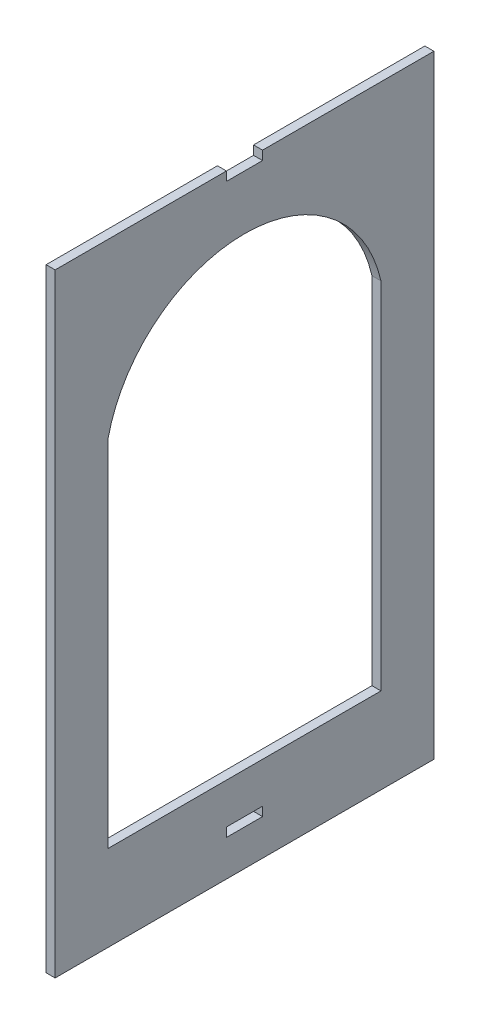
ISO-10303-21;
HEADER;
FILE_DESCRIPTION(('STEP AP214'),'2;1');
FILE_NAME('part.step','',(''),(''),'','','');
FILE_SCHEMA(('AUTOMOTIVE_DESIGN { 1 0 10303 214 1 1 1 1 }'));
ENDSEC;
DATA;
#1=APPLICATION_CONTEXT('core data for automotive mechanical design processes');
#2=APPLICATION_PROTOCOL_DEFINITION('international standard','automotive_design',2000,#1);
#3=PRODUCT_CONTEXT('',#1,'mechanical');
#4=PRODUCT('Part','Part','',(#3));
#5=PRODUCT_RELATED_PRODUCT_CATEGORY('part','',(#4));
#6=PRODUCT_DEFINITION_FORMATION('','',#4);
#7=PRODUCT_DEFINITION_CONTEXT('part definition',#1,'design');
#8=PRODUCT_DEFINITION('design','',#6,#7);
#9=PRODUCT_DEFINITION_SHAPE('','',#8);
#10=(LENGTH_UNIT() NAMED_UNIT(*) SI_UNIT(.MILLI.,.METRE.));
#11=(NAMED_UNIT(*) PLANE_ANGLE_UNIT() SI_UNIT($,.RADIAN.));
#12=(NAMED_UNIT(*) SI_UNIT($,.STERADIAN.) SOLID_ANGLE_UNIT());
#13=UNCERTAINTY_MEASURE_WITH_UNIT(LENGTH_MEASURE(1.E-05),#10,'distance_accuracy_value','');
#14=(GEOMETRIC_REPRESENTATION_CONTEXT(3) GLOBAL_UNCERTAINTY_ASSIGNED_CONTEXT((#13)) GLOBAL_UNIT_ASSIGNED_CONTEXT((#10,
#11,#12)) REPRESENTATION_CONTEXT('',''));
#15=CARTESIAN_POINT('',(0.,0.,0.));
#16=DIRECTION('',(0.,0.,1.));
#17=DIRECTION('',(1.,0.,0.));
#18=AXIS2_PLACEMENT_3D('',#15,#16,#17);
#19=CARTESIAN_POINT('',(6.35,0.,0.));
#20=DIRECTION('',(1.,0.,0.));
#21=DIRECTION('',(0.,0.,-1.));
#22=AXIS2_PLACEMENT_3D('',#19,#20,#21);
#23=PLANE('',#22);
#24=DIRECTION('',(0.,1.,0.));
#25=VECTOR('',#24,1.);
#26=CARTESIAN_POINT('',(6.35,215.9,-133.35));
#27=LINE('',#26,#25);
#28=CARTESIAN_POINT('',(6.35,-215.9,-133.35));
#29=VERTEX_POINT('',#28);
#30=CARTESIAN_POINT('',(6.35,215.9,-133.35));
#31=VERTEX_POINT('',#30);
#32=EDGE_CURVE('E215',#29,#31,#27,.T.);
#33=ORIENTED_EDGE('',*,*,#32,.T.);
#34=DIRECTION('',(0.,0.,1.));
#35=VECTOR('',#34,1.);
#36=CARTESIAN_POINT('',(6.35,215.9,-12.7));
#37=LINE('',#36,#35);
#38=CARTESIAN_POINT('',(6.35,215.9,-12.7));
#39=VERTEX_POINT('',#38);
#40=EDGE_CURVE('E218',#31,#39,#37,.T.);
#41=ORIENTED_EDGE('',*,*,#40,.T.);
#42=DIRECTION('',(0.,-1.,0.));
#43=VECTOR('',#42,1.);
#44=CARTESIAN_POINT('',(6.35,209.55,-12.7));
#45=LINE('',#44,#43);
#46=CARTESIAN_POINT('',(6.35,209.55,-12.7));
#47=VERTEX_POINT('',#46);
#48=EDGE_CURVE('E221',#39,#47,#45,.T.);
#49=ORIENTED_EDGE('',*,*,#48,.T.);
#50=DIRECTION('',(0.,0.,1.));
#51=VECTOR('',#50,1.);
#52=CARTESIAN_POINT('',(6.35,209.55,12.6999999999998));
#53=LINE('',#52,#51);
#54=CARTESIAN_POINT('',(6.35,209.55,12.6999999999998));
#55=VERTEX_POINT('',#54);
#56=EDGE_CURVE('E223',#47,#55,#53,.T.);
#57=ORIENTED_EDGE('',*,*,#56,.T.);
#58=DIRECTION('',(0.,1.,0.));
#59=VECTOR('',#58,1.);
#60=CARTESIAN_POINT('',(6.35,209.55,12.6999999999998));
#61=LINE('',#60,#59);
#62=CARTESIAN_POINT('',(6.35,215.9,12.6999999999998));
#63=VERTEX_POINT('',#62);
#64=EDGE_CURVE('E225',#55,#63,#61,.T.);
#65=ORIENTED_EDGE('',*,*,#64,.T.);
#66=DIRECTION('',(0.,0.,1.));
#67=VECTOR('',#66,1.);
#68=CARTESIAN_POINT('',(6.35,215.9,133.35));
#69=LINE('',#68,#67);
#70=CARTESIAN_POINT('',(6.35,215.9,133.35));
#71=VERTEX_POINT('',#70);
#72=EDGE_CURVE('E227',#63,#71,#69,.T.);
#73=ORIENTED_EDGE('',*,*,#72,.T.);
#74=DIRECTION('',(0.,-1.,0.));
#75=VECTOR('',#74,1.);
#76=CARTESIAN_POINT('',(6.35,215.9,133.35));
#77=LINE('',#76,#75);
#78=CARTESIAN_POINT('',(6.35,-215.9,133.35));
#79=VERTEX_POINT('',#78);
#80=EDGE_CURVE('E229',#71,#79,#77,.T.);
#81=ORIENTED_EDGE('',*,*,#80,.T.);
#82=DIRECTION('',(0.,0.,-1.));
#83=VECTOR('',#82,1.);
#84=CARTESIAN_POINT('',(6.35,-215.9,133.35));
#85=LINE('',#84,#83);
#86=EDGE_CURVE('E231',#79,#29,#85,.T.);
#87=ORIENTED_EDGE('',*,*,#86,.T.);
#88=EDGE_LOOP('',(#33,#41,#49,#57,#65,#73,#81,#87));
#89=FACE_BOUND('',#88,.T.);
#90=DIRECTION('',(0.,0.,1.));
#91=VECTOR('',#90,1.);
#92=CARTESIAN_POINT('',(6.35,-184.15,12.7));
#93=LINE('',#92,#91);
#94=CARTESIAN_POINT('',(6.35,-184.15,-12.7));
#95=VERTEX_POINT('',#94);
#96=CARTESIAN_POINT('',(6.35,-184.15,12.7));
#97=VERTEX_POINT('',#96);
#98=EDGE_CURVE('E186',#95,#97,#93,.T.);
#99=ORIENTED_EDGE('',*,*,#98,.F.);
#100=DIRECTION('',(0.,1.,0.));
#101=VECTOR('',#100,1.);
#102=CARTESIAN_POINT('',(6.35,-184.15,-12.7));
#103=LINE('',#102,#101);
#104=CARTESIAN_POINT('',(6.35,-190.5,-12.7));
#105=VERTEX_POINT('',#104);
#106=EDGE_CURVE('E184',#105,#95,#103,.T.);
#107=ORIENTED_EDGE('',*,*,#106,.F.);
#108=DIRECTION('',(0.,0.,-1.));
#109=VECTOR('',#108,1.);
#110=CARTESIAN_POINT('',(6.35,-190.5,12.7));
#111=LINE('',#110,#109);
#112=CARTESIAN_POINT('',(6.35,-190.5,12.7));
#113=VERTEX_POINT('',#112);
#114=EDGE_CURVE('E192',#113,#105,#111,.T.);
#115=ORIENTED_EDGE('',*,*,#114,.F.);
#116=DIRECTION('',(0.,-1.,0.));
#117=VECTOR('',#116,1.);
#118=CARTESIAN_POINT('',(6.35,-184.15,12.7));
#119=LINE('',#118,#117);
#120=EDGE_CURVE('E189',#97,#113,#119,.T.);
#121=ORIENTED_EDGE('',*,*,#120,.F.);
#122=EDGE_LOOP('',(#99,#107,#115,#121));
#123=FACE_BOUND('',#122,.T.);
#124=CARTESIAN_POINT('',(6.35,72.8095333447275,0.));
#125=DIRECTION('',(1.,0.,0.));
#126=DIRECTION('',(0.,0.,1.));
#127=AXIS2_PLACEMENT_3D('',#124,#125,#126);
#128=CIRCLE('',#127,98.4789578135907);
#129=CARTESIAN_POINT('',(6.35,94.4580952380953,-96.07));
#130=VERTEX_POINT('',#129);
#131=CARTESIAN_POINT('',(6.35,94.4580952380953,96.07));
#132=VERTEX_POINT('',#131);
#133=EDGE_CURVE('E156',#130,#132,#128,.T.);
#134=ORIENTED_EDGE('',*,*,#133,.F.);
#135=DIRECTION('',(0.,1.,0.));
#136=VECTOR('',#135,1.);
#137=CARTESIAN_POINT('',(6.35,94.4580952380952,-96.07));
#138=LINE('',#137,#136);
#139=CARTESIAN_POINT('',(6.35,-155.541904761905,-96.07));
#140=VERTEX_POINT('',#139);
#141=EDGE_CURVE('E148',#140,#130,#138,.T.);
#142=ORIENTED_EDGE('',*,*,#141,.F.);
#143=DIRECTION('',(0.,0.,-1.));
#144=VECTOR('',#143,1.);
#145=CARTESIAN_POINT('',(6.35,-155.541904761905,96.07));
#146=LINE('',#145,#144);
#147=CARTESIAN_POINT('',(6.35,-155.541904761905,96.07));
#148=VERTEX_POINT('',#147);
#149=EDGE_CURVE('E170',#148,#140,#146,.T.);
#150=ORIENTED_EDGE('',*,*,#149,.F.);
#151=DIRECTION('',(0.,-1.,0.));
#152=VECTOR('',#151,1.);
#153=CARTESIAN_POINT('',(6.35,94.4580952380953,96.07));
#154=LINE('',#153,#152);
#155=EDGE_CURVE('E168',#132,#148,#154,.T.);
#156=ORIENTED_EDGE('',*,*,#155,.F.);
#157=EDGE_LOOP('',(#134,#142,#150,#156));
#158=FACE_BOUND('',#157,.T.);
#159=ADVANCED_FACE('F35',(#89,#123,#158),#23,.T.);
#160=CARTESIAN_POINT('',(0.,0.,0.));
#161=DIRECTION('',(1.,0.,0.));
#162=DIRECTION('',(0.,0.,-1.));
#163=AXIS2_PLACEMENT_3D('',#160,#161,#162);
#164=PLANE('',#163);
#165=DIRECTION('',(0.,1.,0.));
#166=VECTOR('',#165,1.);
#167=CARTESIAN_POINT('',(0.,-184.15,-12.7));
#168=LINE('',#167,#166);
#169=CARTESIAN_POINT('',(0.,-190.5,-12.7));
#170=VERTEX_POINT('',#169);
#171=CARTESIAN_POINT('',(0.,-184.15,-12.7));
#172=VERTEX_POINT('',#171);
#173=EDGE_CURVE('E164',#170,#172,#168,.T.);
#174=ORIENTED_EDGE('',*,*,#173,.T.);
#175=DIRECTION('',(0.,0.,1.));
#176=VECTOR('',#175,1.);
#177=CARTESIAN_POINT('',(0.,-184.15,12.7));
#178=LINE('',#177,#176);
#179=CARTESIAN_POINT('',(0.,-184.15,12.7));
#180=VERTEX_POINT('',#179);
#181=EDGE_CURVE('E197',#172,#180,#178,.T.);
#182=ORIENTED_EDGE('',*,*,#181,.T.);
#183=DIRECTION('',(0.,-1.,0.));
#184=VECTOR('',#183,1.);
#185=CARTESIAN_POINT('',(0.,-184.15,12.7));
#186=LINE('',#185,#184);
#187=CARTESIAN_POINT('',(0.,-190.5,12.7));
#188=VERTEX_POINT('',#187);
#189=EDGE_CURVE('E200',#180,#188,#186,.T.);
#190=ORIENTED_EDGE('',*,*,#189,.T.);
#191=DIRECTION('',(0.,0.,-1.));
#192=VECTOR('',#191,1.);
#193=CARTESIAN_POINT('',(0.,-190.5,12.7));
#194=LINE('',#193,#192);
#195=EDGE_CURVE('E187',#188,#170,#194,.T.);
#196=ORIENTED_EDGE('',*,*,#195,.T.);
#197=EDGE_LOOP('',(#174,#182,#190,#196));
#198=FACE_BOUND('',#197,.T.);
#199=DIRECTION('',(0.,1.,0.));
#200=VECTOR('',#199,1.);
#201=CARTESIAN_POINT('',(0.,215.9,-133.35));
#202=LINE('',#201,#200);
#203=CARTESIAN_POINT('',(0.,-215.9,-133.35));
#204=VERTEX_POINT('',#203);
#205=CARTESIAN_POINT('',(0.,215.9,-133.35));
#206=VERTEX_POINT('',#205);
#207=EDGE_CURVE('E214',#204,#206,#202,.T.);
#208=ORIENTED_EDGE('',*,*,#207,.F.);
#209=DIRECTION('',(0.,0.,-1.));
#210=VECTOR('',#209,1.);
#211=CARTESIAN_POINT('',(0.,-215.9,133.35));
#212=LINE('',#211,#210);
#213=CARTESIAN_POINT('',(0.,-215.9,133.35));
#214=VERTEX_POINT('',#213);
#215=EDGE_CURVE('E219',#214,#204,#212,.T.);
#216=ORIENTED_EDGE('',*,*,#215,.F.);
#217=DIRECTION('',(0.,-1.,0.));
#218=VECTOR('',#217,1.);
#219=CARTESIAN_POINT('',(0.,215.9,133.35));
#220=LINE('',#219,#218);
#221=CARTESIAN_POINT('',(0.,215.9,133.35));
#222=VERTEX_POINT('',#221);
#223=EDGE_CURVE('E246',#222,#214,#220,.T.);
#224=ORIENTED_EDGE('',*,*,#223,.F.);
#225=DIRECTION('',(0.,0.,1.));
#226=VECTOR('',#225,1.);
#227=CARTESIAN_POINT('',(0.,215.9,133.35));
#228=LINE('',#227,#226);
#229=CARTESIAN_POINT('',(0.,215.9,12.6999999999998));
#230=VERTEX_POINT('',#229);
#231=EDGE_CURVE('E244',#230,#222,#228,.T.);
#232=ORIENTED_EDGE('',*,*,#231,.F.);
#233=DIRECTION('',(0.,1.,0.));
#234=VECTOR('',#233,1.);
#235=CARTESIAN_POINT('',(0.,209.55,12.6999999999998));
#236=LINE('',#235,#234);
#237=CARTESIAN_POINT('',(0.,209.55,12.6999999999998));
#238=VERTEX_POINT('',#237);
#239=EDGE_CURVE('E242',#238,#230,#236,.T.);
#240=ORIENTED_EDGE('',*,*,#239,.F.);
#241=DIRECTION('',(0.,0.,1.));
#242=VECTOR('',#241,1.);
#243=CARTESIAN_POINT('',(0.,209.55,12.6999999999998));
#244=LINE('',#243,#242);
#245=CARTESIAN_POINT('',(0.,209.55,-12.7));
#246=VERTEX_POINT('',#245);
#247=EDGE_CURVE('E240',#246,#238,#244,.T.);
#248=ORIENTED_EDGE('',*,*,#247,.F.);
#249=DIRECTION('',(0.,-1.,0.));
#250=VECTOR('',#249,1.);
#251=CARTESIAN_POINT('',(0.,209.55,-12.7));
#252=LINE('',#251,#250);
#253=CARTESIAN_POINT('',(0.,215.9,-12.7));
#254=VERTEX_POINT('',#253);
#255=EDGE_CURVE('E238',#254,#246,#252,.T.);
#256=ORIENTED_EDGE('',*,*,#255,.F.);
#257=DIRECTION('',(0.,0.,1.));
#258=VECTOR('',#257,1.);
#259=CARTESIAN_POINT('',(0.,215.9,-12.7));
#260=LINE('',#259,#258);
#261=EDGE_CURVE('E236',#206,#254,#260,.T.);
#262=ORIENTED_EDGE('',*,*,#261,.F.);
#263=EDGE_LOOP('',(#208,#216,#224,#232,#240,#248,#256,#262));
#264=FACE_BOUND('',#263,.T.);
#265=DIRECTION('',(0.,1.,0.));
#266=VECTOR('',#265,1.);
#267=CARTESIAN_POINT('',(0.,94.4580952380952,-96.07));
#268=LINE('',#267,#266);
#269=CARTESIAN_POINT('',(0.,-155.541904761905,-96.07));
#270=VERTEX_POINT('',#269);
#271=CARTESIAN_POINT('',(0.,94.4580952380953,-96.07));
#272=VERTEX_POINT('',#271);
#273=EDGE_CURVE('E58',#270,#272,#268,.T.);
#274=ORIENTED_EDGE('',*,*,#273,.T.);
#275=CARTESIAN_POINT('',(0.,72.8095333447275,0.));
#276=DIRECTION('',(1.,0.,0.));
#277=DIRECTION('',(0.,0.,1.));
#278=AXIS2_PLACEMENT_3D('',#275,#276,#277);
#279=CIRCLE('',#278,98.4789578135907);
#280=CARTESIAN_POINT('',(0.,94.4580952380953,96.07));
#281=VERTEX_POINT('',#280);
#282=EDGE_CURVE('E163',#272,#281,#279,.T.);
#283=ORIENTED_EDGE('',*,*,#282,.T.);
#284=DIRECTION('',(0.,-1.,0.));
#285=VECTOR('',#284,1.);
#286=CARTESIAN_POINT('',(0.,94.4580952380953,96.07));
#287=LINE('',#286,#285);
#288=CARTESIAN_POINT('',(0.,-155.541904761905,96.07));
#289=VERTEX_POINT('',#288);
#290=EDGE_CURVE('E176',#281,#289,#287,.T.);
#291=ORIENTED_EDGE('',*,*,#290,.T.);
#292=DIRECTION('',(0.,0.,-1.));
#293=VECTOR('',#292,1.);
#294=CARTESIAN_POINT('',(0.,-155.541904761905,96.07));
#295=LINE('',#294,#293);
#296=EDGE_CURVE('E157',#289,#270,#295,.T.);
#297=ORIENTED_EDGE('',*,*,#296,.T.);
#298=EDGE_LOOP('',(#274,#283,#291,#297));
#299=FACE_BOUND('',#298,.T.);
#300=ADVANCED_FACE('F276',(#198,#264,#299),#164,.F.);
#301=CARTESIAN_POINT('',(6.35,215.9,-133.35));
#302=DIRECTION('',(0.,0.,1.));
#303=DIRECTION('',(0.,-1.,0.));
#304=AXIS2_PLACEMENT_3D('',#301,#302,#303);
#305=PLANE('',#304);
#306=ORIENTED_EDGE('',*,*,#207,.T.);
#307=DIRECTION('',(-1.,0.,0.));
#308=VECTOR('',#307,1.);
#309=CARTESIAN_POINT('',(6.35,215.9,-133.35));
#310=LINE('',#309,#308);
#311=EDGE_CURVE('E11',#31,#206,#310,.T.);
#312=ORIENTED_EDGE('',*,*,#311,.F.);
#313=ORIENTED_EDGE('',*,*,#32,.F.);
#314=DIRECTION('',(-1.,0.,0.));
#315=VECTOR('',#314,1.);
#316=CARTESIAN_POINT('',(6.35,-215.9,-133.35));
#317=LINE('',#316,#315);
#318=EDGE_CURVE('E233',#29,#204,#317,.T.);
#319=ORIENTED_EDGE('',*,*,#318,.T.);
#320=EDGE_LOOP('',(#306,#312,#313,#319));
#321=FACE_BOUND('',#320,.T.);
#322=ADVANCED_FACE('F37',(#321),#305,.F.);
#323=CARTESIAN_POINT('',(6.35,215.9,-12.7));
#324=DIRECTION('',(0.,-1.,0.));
#325=DIRECTION('',(0.,0.,-1.));
#326=AXIS2_PLACEMENT_3D('',#323,#324,#325);
#327=PLANE('',#326);
#328=ORIENTED_EDGE('',*,*,#261,.T.);
#329=DIRECTION('',(-1.,0.,0.));
#330=VECTOR('',#329,1.);
#331=CARTESIAN_POINT('',(6.35,215.9,-12.7));
#332=LINE('',#331,#330);
#333=EDGE_CURVE('E43',#39,#254,#332,.T.);
#334=ORIENTED_EDGE('',*,*,#333,.F.);
#335=ORIENTED_EDGE('',*,*,#40,.F.);
#336=ORIENTED_EDGE('',*,*,#311,.T.);
#337=EDGE_LOOP('',(#328,#334,#335,#336));
#338=FACE_BOUND('',#337,.T.);
#339=ADVANCED_FACE('F294',(#338),#327,.F.);
#340=CARTESIAN_POINT('',(6.35,209.55,-12.7));
#341=DIRECTION('',(0.,0.,-1.));
#342=DIRECTION('',(-1.,0.,0.));
#343=AXIS2_PLACEMENT_3D('',#340,#341,#342);
#344=PLANE('',#343);
#345=ORIENTED_EDGE('',*,*,#255,.T.);
#346=DIRECTION('',(-1.,0.,0.));
#347=VECTOR('',#346,1.);
#348=CARTESIAN_POINT('',(6.35,209.55,-12.7));
#349=LINE('',#348,#347);
#350=EDGE_CURVE('E263',#47,#246,#349,.T.);
#351=ORIENTED_EDGE('',*,*,#350,.F.);
#352=ORIENTED_EDGE('',*,*,#48,.F.);
#353=ORIENTED_EDGE('',*,*,#333,.T.);
#354=EDGE_LOOP('',(#345,#351,#352,#353));
#355=FACE_BOUND('',#354,.T.);
#356=ADVANCED_FACE('F270',(#355),#344,.F.);
#357=CARTESIAN_POINT('',(6.35,209.55,12.6999999999998));
#358=DIRECTION('',(0.,-1.,0.));
#359=DIRECTION('',(0.,0.,-1.));
#360=AXIS2_PLACEMENT_3D('',#357,#358,#359);
#361=PLANE('',#360);
#362=ORIENTED_EDGE('',*,*,#247,.T.);
#363=DIRECTION('',(-1.,0.,0.));
#364=VECTOR('',#363,1.);
#365=CARTESIAN_POINT('',(6.35,209.55,12.6999999999998));
#366=LINE('',#365,#364);
#367=EDGE_CURVE('E260',#55,#238,#366,.T.);
#368=ORIENTED_EDGE('',*,*,#367,.F.);
#369=ORIENTED_EDGE('',*,*,#56,.F.);
#370=ORIENTED_EDGE('',*,*,#350,.T.);
#371=EDGE_LOOP('',(#362,#368,#369,#370));
#372=FACE_BOUND('',#371,.T.);
#373=ADVANCED_FACE('F282',(#372),#361,.F.);
#374=CARTESIAN_POINT('',(6.35,209.55,12.6999999999998));
#375=DIRECTION('',(0.,0.,1.));
#376=DIRECTION('',(1.,0.,0.));
#377=AXIS2_PLACEMENT_3D('',#374,#375,#376);
#378=PLANE('',#377);
#379=ORIENTED_EDGE('',*,*,#239,.T.);
#380=DIRECTION('',(-1.,0.,0.));
#381=VECTOR('',#380,1.);
#382=CARTESIAN_POINT('',(6.35,215.9,12.6999999999998));
#383=LINE('',#382,#381);
#384=EDGE_CURVE('E257',#63,#230,#383,.T.);
#385=ORIENTED_EDGE('',*,*,#384,.F.);
#386=ORIENTED_EDGE('',*,*,#64,.F.);
#387=ORIENTED_EDGE('',*,*,#367,.T.);
#388=EDGE_LOOP('',(#379,#385,#386,#387));
#389=FACE_BOUND('',#388,.T.);
#390=ADVANCED_FACE('F286',(#389),#378,.F.);
#391=CARTESIAN_POINT('',(6.35,215.9,133.35));
#392=DIRECTION('',(0.,-1.,0.));
#393=DIRECTION('',(0.,0.,-1.));
#394=AXIS2_PLACEMENT_3D('',#391,#392,#393);
#395=PLANE('',#394);
#396=ORIENTED_EDGE('',*,*,#231,.T.);
#397=DIRECTION('',(-1.,0.,0.));
#398=VECTOR('',#397,1.);
#399=CARTESIAN_POINT('',(6.35,215.9,133.35));
#400=LINE('',#399,#398);
#401=EDGE_CURVE('E254',#71,#222,#400,.T.);
#402=ORIENTED_EDGE('',*,*,#401,.F.);
#403=ORIENTED_EDGE('',*,*,#72,.F.);
#404=ORIENTED_EDGE('',*,*,#384,.T.);
#405=EDGE_LOOP('',(#396,#402,#403,#404));
#406=FACE_BOUND('',#405,.T.);
#407=ADVANCED_FACE('F307',(#406),#395,.F.);
#408=CARTESIAN_POINT('',(6.35,215.9,133.35));
#409=DIRECTION('',(0.,0.,-1.));
#410=DIRECTION('',(0.,1.,0.));
#411=AXIS2_PLACEMENT_3D('',#408,#409,#410);
#412=PLANE('',#411);
#413=ORIENTED_EDGE('',*,*,#223,.T.);
#414=DIRECTION('',(-1.,0.,0.));
#415=VECTOR('',#414,1.);
#416=CARTESIAN_POINT('',(6.35,-215.9,133.35));
#417=LINE('',#416,#415);
#418=EDGE_CURVE('E251',#79,#214,#417,.T.);
#419=ORIENTED_EDGE('',*,*,#418,.F.);
#420=ORIENTED_EDGE('',*,*,#80,.F.);
#421=ORIENTED_EDGE('',*,*,#401,.T.);
#422=EDGE_LOOP('',(#413,#419,#420,#421));
#423=FACE_BOUND('',#422,.T.);
#424=ADVANCED_FACE('F305',(#423),#412,.F.);
#425=CARTESIAN_POINT('',(6.35,-215.9,133.35));
#426=DIRECTION('',(0.,1.,0.));
#427=DIRECTION('',(0.,0.,1.));
#428=AXIS2_PLACEMENT_3D('',#425,#426,#427);
#429=PLANE('',#428);
#430=ORIENTED_EDGE('',*,*,#215,.T.);
#431=ORIENTED_EDGE('',*,*,#318,.F.);
#432=ORIENTED_EDGE('',*,*,#86,.F.);
#433=ORIENTED_EDGE('',*,*,#418,.T.);
#434=EDGE_LOOP('',(#430,#431,#432,#433));
#435=FACE_BOUND('',#434,.T.);
#436=ADVANCED_FACE('F300',(#435),#429,.F.);
#437=CARTESIAN_POINT('',(6.35,-184.15,-12.7));
#438=DIRECTION('',(0.,0.,1.));
#439=DIRECTION('',(0.,-1.,0.));
#440=AXIS2_PLACEMENT_3D('',#437,#438,#439);
#441=PLANE('',#440);
#442=ORIENTED_EDGE('',*,*,#173,.F.);
#443=DIRECTION('',(-1.,0.,0.));
#444=VECTOR('',#443,1.);
#445=CARTESIAN_POINT('',(6.35,-190.5,-12.7));
#446=LINE('',#445,#444);
#447=EDGE_CURVE('E194',#105,#170,#446,.T.);
#448=ORIENTED_EDGE('',*,*,#447,.F.);
#449=ORIENTED_EDGE('',*,*,#106,.T.);
#450=DIRECTION('',(-1.,0.,0.));
#451=VECTOR('',#450,1.);
#452=CARTESIAN_POINT('',(6.35,-184.15,-12.7));
#453=LINE('',#452,#451);
#454=EDGE_CURVE('E211',#95,#172,#453,.T.);
#455=ORIENTED_EDGE('',*,*,#454,.T.);
#456=EDGE_LOOP('',(#442,#448,#449,#455));
#457=FACE_BOUND('',#456,.T.);
#458=ADVANCED_FACE('F324',(#457),#441,.T.);
#459=CARTESIAN_POINT('',(6.35,-184.15,12.7));
#460=DIRECTION('',(0.,-1.,0.));
#461=DIRECTION('',(0.,0.,-1.));
#462=AXIS2_PLACEMENT_3D('',#459,#460,#461);
#463=PLANE('',#462);
#464=ORIENTED_EDGE('',*,*,#181,.F.);
#465=ORIENTED_EDGE('',*,*,#454,.F.);
#466=ORIENTED_EDGE('',*,*,#98,.T.);
#467=DIRECTION('',(-1.,0.,0.));
#468=VECTOR('',#467,1.);
#469=CARTESIAN_POINT('',(6.35,-184.15,12.7));
#470=LINE('',#469,#468);
#471=EDGE_CURVE('E209',#97,#180,#470,.T.);
#472=ORIENTED_EDGE('',*,*,#471,.T.);
#473=EDGE_LOOP('',(#464,#465,#466,#472));
#474=FACE_BOUND('',#473,.T.);
#475=ADVANCED_FACE('F331',(#474),#463,.T.);
#476=CARTESIAN_POINT('',(6.35,-184.15,12.7));
#477=DIRECTION('',(0.,0.,-1.));
#478=DIRECTION('',(-1.,0.,0.));
#479=AXIS2_PLACEMENT_3D('',#476,#477,#478);
#480=PLANE('',#479);
#481=ORIENTED_EDGE('',*,*,#189,.F.);
#482=ORIENTED_EDGE('',*,*,#471,.F.);
#483=ORIENTED_EDGE('',*,*,#120,.T.);
#484=DIRECTION('',(-1.,0.,0.));
#485=VECTOR('',#484,1.);
#486=CARTESIAN_POINT('',(6.35,-190.5,12.7));
#487=LINE('',#486,#485);
#488=EDGE_CURVE('E207',#113,#188,#487,.T.);
#489=ORIENTED_EDGE('',*,*,#488,.T.);
#490=EDGE_LOOP('',(#481,#482,#483,#489));
#491=FACE_BOUND('',#490,.T.);
#492=ADVANCED_FACE('F336',(#491),#480,.T.);
#493=CARTESIAN_POINT('',(6.35,-190.5,12.7));
#494=DIRECTION('',(0.,1.,0.));
#495=DIRECTION('',(0.,0.,1.));
#496=AXIS2_PLACEMENT_3D('',#493,#494,#495);
#497=PLANE('',#496);
#498=ORIENTED_EDGE('',*,*,#195,.F.);
#499=ORIENTED_EDGE('',*,*,#488,.F.);
#500=ORIENTED_EDGE('',*,*,#114,.T.);
#501=ORIENTED_EDGE('',*,*,#447,.T.);
#502=EDGE_LOOP('',(#498,#499,#500,#501));
#503=FACE_BOUND('',#502,.T.);
#504=ADVANCED_FACE('F343',(#503),#497,.T.);
#505=CARTESIAN_POINT('',(6.35,94.4580952380952,-96.07));
#506=DIRECTION('',(0.,0.,1.));
#507=DIRECTION('',(0.,-1.,0.));
#508=AXIS2_PLACEMENT_3D('',#505,#506,#507);
#509=PLANE('',#508);
#510=ORIENTED_EDGE('',*,*,#273,.F.);
#511=DIRECTION('',(-1.,0.,0.));
#512=VECTOR('',#511,1.);
#513=CARTESIAN_POINT('',(6.35,-155.541904761905,-96.07));
#514=LINE('',#513,#512);
#515=EDGE_CURVE('E152',#140,#270,#514,.T.);
#516=ORIENTED_EDGE('',*,*,#515,.F.);
#517=ORIENTED_EDGE('',*,*,#141,.T.);
#518=DIRECTION('',(-1.,0.,0.));
#519=VECTOR('',#518,1.);
#520=CARTESIAN_POINT('',(6.35,94.4580952380953,-96.07));
#521=LINE('',#520,#519);
#522=EDGE_CURVE('E151',#130,#272,#521,.T.);
#523=ORIENTED_EDGE('',*,*,#522,.T.);
#524=EDGE_LOOP('',(#510,#516,#517,#523));
#525=FACE_BOUND('',#524,.T.);
#526=ADVANCED_FACE('F150',(#525),#509,.T.);
#527=CARTESIAN_POINT('',(6.35,72.8095333447275,0.));
#528=DIRECTION('',(-1.,0.,0.));
#529=DIRECTION('',(0.,0.,1.));
#530=AXIS2_PLACEMENT_3D('',#527,#528,#529);
#531=CYLINDRICAL_SURFACE('',#530,98.4789578135907);
#532=ORIENTED_EDGE('',*,*,#282,.F.);
#533=ORIENTED_EDGE('',*,*,#522,.F.);
#534=ORIENTED_EDGE('',*,*,#133,.T.);
#535=DIRECTION('',(-1.,0.,0.));
#536=VECTOR('',#535,1.);
#537=CARTESIAN_POINT('',(6.35,94.4580952380953,96.07));
#538=LINE('',#537,#536);
#539=EDGE_CURVE('E165',#132,#281,#538,.T.);
#540=ORIENTED_EDGE('',*,*,#539,.T.);
#541=EDGE_LOOP('',(#532,#533,#534,#540));
#542=FACE_BOUND('',#541,.T.);
#543=ADVANCED_FACE('F160',(#542),#531,.F.);
#544=CARTESIAN_POINT('',(6.35,94.4580952380953,96.07));
#545=DIRECTION('',(0.,0.,-1.));
#546=DIRECTION('',(0.,1.,0.));
#547=AXIS2_PLACEMENT_3D('',#544,#545,#546);
#548=PLANE('',#547);
#549=ORIENTED_EDGE('',*,*,#290,.F.);
#550=ORIENTED_EDGE('',*,*,#539,.F.);
#551=ORIENTED_EDGE('',*,*,#155,.T.);
#552=DIRECTION('',(-1.,0.,0.));
#553=VECTOR('',#552,1.);
#554=CARTESIAN_POINT('',(6.35,-155.541904761905,96.07));
#555=LINE('',#554,#553);
#556=EDGE_CURVE('E50',#148,#289,#555,.T.);
#557=ORIENTED_EDGE('',*,*,#556,.T.);
#558=EDGE_LOOP('',(#549,#550,#551,#557));
#559=FACE_BOUND('',#558,.T.);
#560=ADVANCED_FACE('F361',(#559),#548,.T.);
#561=CARTESIAN_POINT('',(6.35,-155.541904761905,96.07));
#562=DIRECTION('',(0.,1.,0.));
#563=DIRECTION('',(0.,0.,1.));
#564=AXIS2_PLACEMENT_3D('',#561,#562,#563);
#565=PLANE('',#564);
#566=ORIENTED_EDGE('',*,*,#296,.F.);
#567=ORIENTED_EDGE('',*,*,#556,.F.);
#568=ORIENTED_EDGE('',*,*,#149,.T.);
#569=ORIENTED_EDGE('',*,*,#515,.T.);
#570=EDGE_LOOP('',(#566,#567,#568,#569));
#571=FACE_BOUND('',#570,.T.);
#572=ADVANCED_FACE('F364',(#571),#565,.T.);
#573=CLOSED_SHELL('',(#159,#300,#322,#339,#356,#373,#390,#407,#424,#436,#458,#475,#492,#504,
#526,#543,#560,#572));
#574=MANIFOLD_SOLID_BREP('B2',#573);
#575=ADVANCED_BREP_SHAPE_REPRESENTATION('',(#18,#574),#14);
#576=SHAPE_DEFINITION_REPRESENTATION(#9,#575);
ENDSEC;
END-ISO-10303-21;
